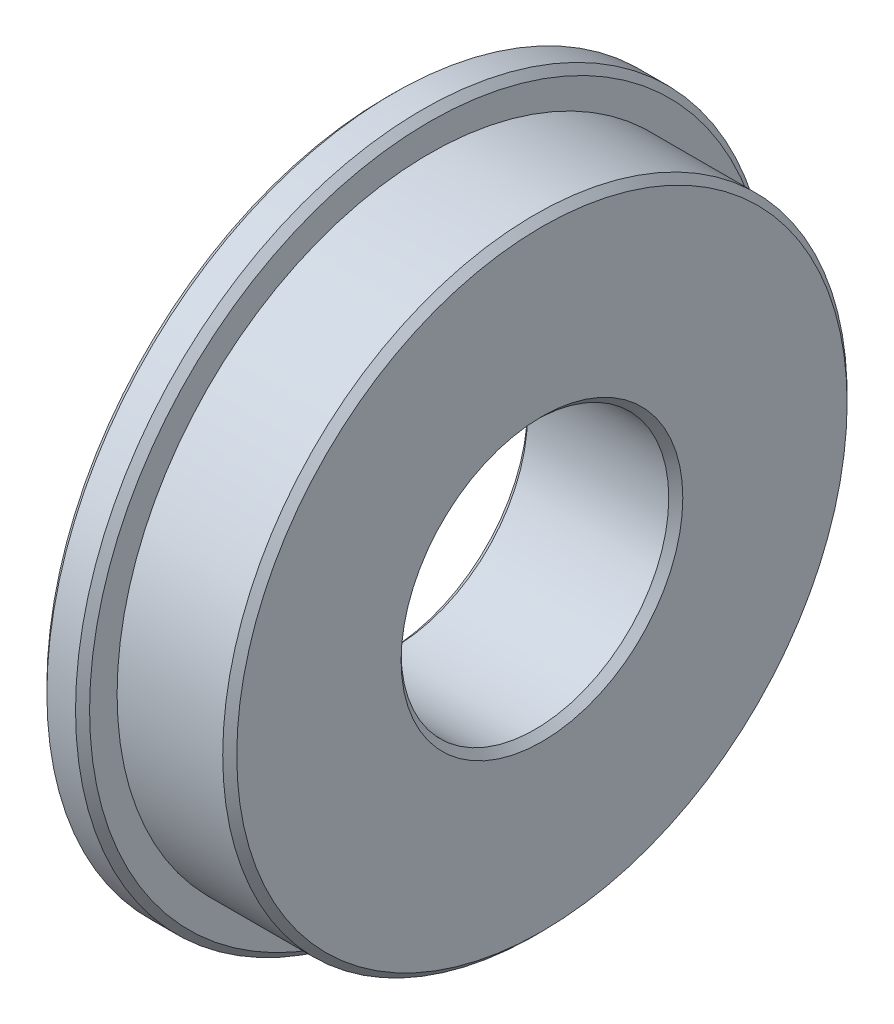
ISO-10303-21;
HEADER;
FILE_DESCRIPTION(('STEP AP214'),'2;1');
FILE_NAME('part.step','',(''),(''),'','','');
FILE_SCHEMA(('AUTOMOTIVE_DESIGN { 1 0 10303 214 1 1 1 1 }'));
ENDSEC;
DATA;
#1=APPLICATION_CONTEXT('core data for automotive mechanical design processes');
#2=APPLICATION_PROTOCOL_DEFINITION('international standard','automotive_design',2000,#1);
#3=PRODUCT_CONTEXT('',#1,'mechanical');
#4=PRODUCT('Part','Part','',(#3));
#5=PRODUCT_RELATED_PRODUCT_CATEGORY('part','',(#4));
#6=PRODUCT_DEFINITION_FORMATION('','',#4);
#7=PRODUCT_DEFINITION_CONTEXT('part definition',#1,'design');
#8=PRODUCT_DEFINITION('design','',#6,#7);
#9=PRODUCT_DEFINITION_SHAPE('','',#8);
#10=(LENGTH_UNIT() NAMED_UNIT(*) SI_UNIT(.MILLI.,.METRE.));
#11=(NAMED_UNIT(*) PLANE_ANGLE_UNIT() SI_UNIT($,.RADIAN.));
#12=(NAMED_UNIT(*) SI_UNIT($,.STERADIAN.) SOLID_ANGLE_UNIT());
#13=UNCERTAINTY_MEASURE_WITH_UNIT(LENGTH_MEASURE(1.E-05),#10,'distance_accuracy_value','');
#14=(GEOMETRIC_REPRESENTATION_CONTEXT(3) GLOBAL_UNCERTAINTY_ASSIGNED_CONTEXT((#13)) GLOBAL_UNIT_ASSIGNED_CONTEXT((#10,
#11,#12)) REPRESENTATION_CONTEXT('',''));
#15=CARTESIAN_POINT('',(0.,0.,0.));
#16=DIRECTION('',(0.,0.,1.));
#17=DIRECTION('',(1.,0.,0.));
#18=AXIS2_PLACEMENT_3D('',#15,#16,#17);
#19=CARTESIAN_POINT('',(5.27999999999999,0.,0.));
#20=DIRECTION('',(-1.,0.,0.));
#21=DIRECTION('',(0.,0.,1.));
#22=AXIS2_PLACEMENT_3D('',#19,#20,#21);
#23=CONICAL_SURFACE('',#22,11.115,0.785398163397442);
#24=CARTESIAN_POINT('',(5.27999999999999,0.,0.));
#25=DIRECTION('',(-1.,0.,0.));
#26=DIRECTION('',(0.,0.,1.));
#27=AXIS2_PLACEMENT_3D('',#24,#25,#26);
#28=CIRCLE('',#27,11.115);
#29=CARTESIAN_POINT('',(5.27999999999999,0.,11.115));
#30=VERTEX_POINT('',#29);
#31=EDGE_CURVE('E30',#30,#30,#28,.T.);
#32=ORIENTED_EDGE('',*,*,#31,.F.);
#33=EDGE_LOOP('',(#32));
#34=FACE_BOUND('',#33,.T.);
#35=CARTESIAN_POINT('',(5.53,0.,0.));
#36=DIRECTION('',(-1.,0.,0.));
#37=DIRECTION('',(0.,0.,1.));
#38=AXIS2_PLACEMENT_3D('',#35,#36,#37);
#39=CIRCLE('',#38,10.865);
#40=CARTESIAN_POINT('',(5.53,0.,10.865));
#41=VERTEX_POINT('',#40);
#42=EDGE_CURVE('E18',#41,#41,#39,.F.);
#43=ORIENTED_EDGE('',*,*,#42,.F.);
#44=EDGE_LOOP('',(#43));
#45=FACE_BOUND('',#44,.T.);
#46=ADVANCED_FACE('F15',(#34,#45),#23,.T.);
#47=CARTESIAN_POINT('',(5.53,0.,0.));
#48=DIRECTION('',(-1.,0.,0.));
#49=DIRECTION('',(0.,0.,1.));
#50=AXIS2_PLACEMENT_3D('',#47,#48,#49);
#51=CYLINDRICAL_SURFACE('',#50,11.115);
#52=CARTESIAN_POINT('',(1.52,0.,0.));
#53=DIRECTION('',(-1.,0.,0.));
#54=DIRECTION('',(0.,0.,1.));
#55=AXIS2_PLACEMENT_3D('',#52,#53,#54);
#56=CIRCLE('',#55,11.115);
#57=CARTESIAN_POINT('',(1.52,0.,11.115));
#58=VERTEX_POINT('',#57);
#59=EDGE_CURVE('E39',#58,#58,#56,.T.);
#60=ORIENTED_EDGE('',*,*,#59,.F.);
#61=EDGE_LOOP('',(#60));
#62=FACE_BOUND('',#61,.T.);
#63=ORIENTED_EDGE('',*,*,#31,.T.);
#64=EDGE_LOOP('',(#63));
#65=FACE_BOUND('',#64,.T.);
#66=ADVANCED_FACE('F49',(#62,#65),#51,.T.);
#67=CARTESIAN_POINT('',(5.53,0.,0.));
#68=DIRECTION('',(1.,0.,0.));
#69=DIRECTION('',(0.,0.,-1.));
#70=AXIS2_PLACEMENT_3D('',#67,#68,#69);
#71=PLANE('',#70);
#72=CARTESIAN_POINT('',(5.53000000002157,0.,0.));
#73=DIRECTION('',(1.,0.,0.));
#74=DIRECTION('',(0.,0.,-1.));
#75=AXIS2_PLACEMENT_3D('',#72,#73,#74);
#76=CIRCLE('',#75,5.01499999995758);
#77=CARTESIAN_POINT('',(5.53000000002157,0.,-5.01499999995758));
#78=VERTEX_POINT('',#77);
#79=EDGE_CURVE('E37',#78,#78,#76,.F.);
#80=ORIENTED_EDGE('',*,*,#79,.T.);
#81=EDGE_LOOP('',(#80));
#82=FACE_BOUND('',#81,.T.);
#83=ORIENTED_EDGE('',*,*,#42,.T.);
#84=EDGE_LOOP('',(#83));
#85=FACE_BOUND('',#84,.T.);
#86=ADVANCED_FACE('F57',(#82,#85),#71,.T.);
#87=CARTESIAN_POINT('',(1.52,0.,0.));
#88=DIRECTION('',(1.,0.,0.));
#89=DIRECTION('',(0.,0.,-1.));
#90=AXIS2_PLACEMENT_3D('',#87,#88,#89);
#91=PLANE('',#90);
#92=ORIENTED_EDGE('',*,*,#59,.T.);
#93=EDGE_LOOP('',(#92));
#94=FACE_BOUND('',#93,.T.);
#95=CARTESIAN_POINT('',(1.52,0.,0.));
#96=DIRECTION('',(-1.,0.,0.));
#97=DIRECTION('',(0.,0.,1.));
#98=AXIS2_PLACEMENT_3D('',#95,#96,#97);
#99=CIRCLE('',#98,12.095);
#100=CARTESIAN_POINT('',(1.52,0.,12.095));
#101=VERTEX_POINT('',#100);
#102=EDGE_CURVE('E33',#101,#101,#99,.T.);
#103=ORIENTED_EDGE('',*,*,#102,.F.);
#104=EDGE_LOOP('',(#103));
#105=FACE_BOUND('',#104,.T.);
#106=ADVANCED_FACE('F89',(#94,#105),#91,.T.);
#107=CARTESIAN_POINT('',(5.52999999985104,0.,0.));
#108=DIRECTION('',(1.,0.,0.));
#109=DIRECTION('',(0.,0.,-1.));
#110=AXIS2_PLACEMENT_3D('',#107,#108,#109);
#111=CONICAL_SURFACE('',#110,5.01499999978705,0.785398163397448);
#112=ORIENTED_EDGE('',*,*,#79,.F.);
#113=EDGE_LOOP('',(#112));
#114=FACE_BOUND('',#113,.T.);
#115=CARTESIAN_POINT('',(5.28,0.,0.));
#116=DIRECTION('',(1.,0.,0.));
#117=DIRECTION('',(0.,0.,-1.));
#118=AXIS2_PLACEMENT_3D('',#115,#116,#117);
#119=CIRCLE('',#118,4.765);
#120=CARTESIAN_POINT('',(5.28,0.,-4.765));
#121=VERTEX_POINT('',#120);
#122=EDGE_CURVE('E36',#121,#121,#119,.F.);
#123=ORIENTED_EDGE('',*,*,#122,.T.);
#124=EDGE_LOOP('',(#123));
#125=FACE_BOUND('',#124,.T.);
#126=ADVANCED_FACE('F85',(#114,#125),#111,.F.);
#127=CARTESIAN_POINT('',(1.26999999999999,0.,0.));
#128=DIRECTION('',(-1.,0.,0.));
#129=DIRECTION('',(0.,0.,1.));
#130=AXIS2_PLACEMENT_3D('',#127,#128,#129);
#131=CONICAL_SURFACE('',#130,12.345,0.785398163397445);
#132=ORIENTED_EDGE('',*,*,#102,.T.);
#133=EDGE_LOOP('',(#132));
#134=FACE_BOUND('',#133,.T.);
#135=CARTESIAN_POINT('',(1.26999999999999,0.,0.));
#136=DIRECTION('',(-1.,0.,0.));
#137=DIRECTION('',(0.,0.,1.));
#138=AXIS2_PLACEMENT_3D('',#135,#136,#137);
#139=CIRCLE('',#138,12.345);
#140=CARTESIAN_POINT('',(1.26999999999999,0.,12.345));
#141=VERTEX_POINT('',#140);
#142=EDGE_CURVE('E101',#141,#141,#139,.T.);
#143=ORIENTED_EDGE('',*,*,#142,.F.);
#144=EDGE_LOOP('',(#143));
#145=FACE_BOUND('',#144,.T.);
#146=ADVANCED_FACE('F81',(#134,#145),#131,.T.);
#147=CARTESIAN_POINT('',(0.,0.,0.));
#148=DIRECTION('',(1.,0.,0.));
#149=DIRECTION('',(0.,0.,-1.));
#150=AXIS2_PLACEMENT_3D('',#147,#148,#149);
#151=CYLINDRICAL_SURFACE('',#150,4.765);
#152=ORIENTED_EDGE('',*,*,#122,.F.);
#153=EDGE_LOOP('',(#152));
#154=FACE_BOUND('',#153,.T.);
#155=CARTESIAN_POINT('',(0.249999999994088,0.,0.));
#156=DIRECTION('',(-1.,0.,0.));
#157=DIRECTION('',(0.,0.,1.));
#158=AXIS2_PLACEMENT_3D('',#155,#156,#157);
#159=CIRCLE('',#158,4.76500000002034);
#160=CARTESIAN_POINT('',(0.249999999994088,0.,4.76500000002034));
#161=VERTEX_POINT('',#160);
#162=EDGE_CURVE('E103',#161,#161,#159,.T.);
#163=ORIENTED_EDGE('',*,*,#162,.T.);
#164=EDGE_LOOP('',(#163));
#165=FACE_BOUND('',#164,.T.);
#166=ADVANCED_FACE('F77',(#154,#165),#151,.F.);
#167=CARTESIAN_POINT('',(1.52,0.,0.));
#168=DIRECTION('',(-1.,0.,0.));
#169=DIRECTION('',(0.,0.,1.));
#170=AXIS2_PLACEMENT_3D('',#167,#168,#169);
#171=CYLINDRICAL_SURFACE('',#170,12.345);
#172=ORIENTED_EDGE('',*,*,#142,.T.);
#173=EDGE_LOOP('',(#172));
#174=FACE_BOUND('',#173,.T.);
#175=CARTESIAN_POINT('',(0.249999999999999,0.,0.));
#176=DIRECTION('',(1.,0.,0.));
#177=DIRECTION('',(0.,0.,-1.));
#178=AXIS2_PLACEMENT_3D('',#175,#176,#177);
#179=CIRCLE('',#178,12.345);
#180=CARTESIAN_POINT('',(0.249999999999999,0.,-12.345));
#181=VERTEX_POINT('',#180);
#182=EDGE_CURVE('E27',#181,#181,#179,.F.);
#183=ORIENTED_EDGE('',*,*,#182,.F.);
#184=EDGE_LOOP('',(#183));
#185=FACE_BOUND('',#184,.T.);
#186=ADVANCED_FACE('F73',(#174,#185),#171,.T.);
#187=CARTESIAN_POINT('',(-1.13686837721616E-10,0.,0.));
#188=DIRECTION('',(-1.,0.,0.));
#189=DIRECTION('',(0.,0.,1.));
#190=AXIS2_PLACEMENT_3D('',#187,#188,#189);
#191=CONICAL_SURFACE('',#190,5.01500000007127,0.785398163283761);
#192=CARTESIAN_POINT('',(-5.6843418860808E-11,0.,0.));
#193=DIRECTION('',(-1.,0.,0.));
#194=DIRECTION('',(0.,0.,1.));
#195=AXIS2_PLACEMENT_3D('',#192,#193,#194);
#196=CIRCLE('',#195,5.01500000001442);
#197=CARTESIAN_POINT('',(-5.6843418860808E-11,0.,5.01500000001442));
#198=VERTEX_POINT('',#197);
#199=EDGE_CURVE('E22',#198,#198,#196,.T.);
#200=ORIENTED_EDGE('',*,*,#199,.T.);
#201=EDGE_LOOP('',(#200));
#202=FACE_BOUND('',#201,.T.);
#203=ORIENTED_EDGE('',*,*,#162,.F.);
#204=EDGE_LOOP('',(#203));
#205=FACE_BOUND('',#204,.T.);
#206=ADVANCED_FACE('F67',(#202,#205),#191,.F.);
#207=CARTESIAN_POINT('',(0.249999999999999,0.,0.));
#208=DIRECTION('',(1.,0.,0.));
#209=DIRECTION('',(0.,0.,-1.));
#210=AXIS2_PLACEMENT_3D('',#207,#208,#209);
#211=CONICAL_SURFACE('',#210,12.345,0.785398163397451);
#212=CARTESIAN_POINT('',(0.,0.,0.));
#213=DIRECTION('',(1.,0.,0.));
#214=DIRECTION('',(0.,0.,-1.));
#215=AXIS2_PLACEMENT_3D('',#212,#213,#214);
#216=CIRCLE('',#215,12.095);
#217=CARTESIAN_POINT('',(0.,0.,-12.095));
#218=VERTEX_POINT('',#217);
#219=EDGE_CURVE('E10',#218,#218,#216,.T.);
#220=ORIENTED_EDGE('',*,*,#219,.T.);
#221=EDGE_LOOP('',(#220));
#222=FACE_BOUND('',#221,.T.);
#223=ORIENTED_EDGE('',*,*,#182,.T.);
#224=EDGE_LOOP('',(#223));
#225=FACE_BOUND('',#224,.T.);
#226=ADVANCED_FACE('F61',(#222,#225),#211,.T.);
#227=CARTESIAN_POINT('',(0.,0.,0.));
#228=DIRECTION('',(1.,0.,0.));
#229=DIRECTION('',(0.,0.,-1.));
#230=AXIS2_PLACEMENT_3D('',#227,#228,#229);
#231=PLANE('',#230);
#232=ORIENTED_EDGE('',*,*,#219,.F.);
#233=EDGE_LOOP('',(#232));
#234=FACE_BOUND('',#233,.T.);
#235=ORIENTED_EDGE('',*,*,#199,.F.);
#236=EDGE_LOOP('',(#235));
#237=FACE_BOUND('',#236,.T.);
#238=ADVANCED_FACE('F59',(#234,#237),#231,.F.);
#239=CLOSED_SHELL('',(#46,#66,#86,#106,#126,#146,#166,#186,#206,#226,#238));
#240=MANIFOLD_SOLID_BREP('B1',#239);
#241=ADVANCED_BREP_SHAPE_REPRESENTATION('',(#18,#240),#14);
#242=SHAPE_DEFINITION_REPRESENTATION(#9,#241);
ENDSEC;
END-ISO-10303-21;
